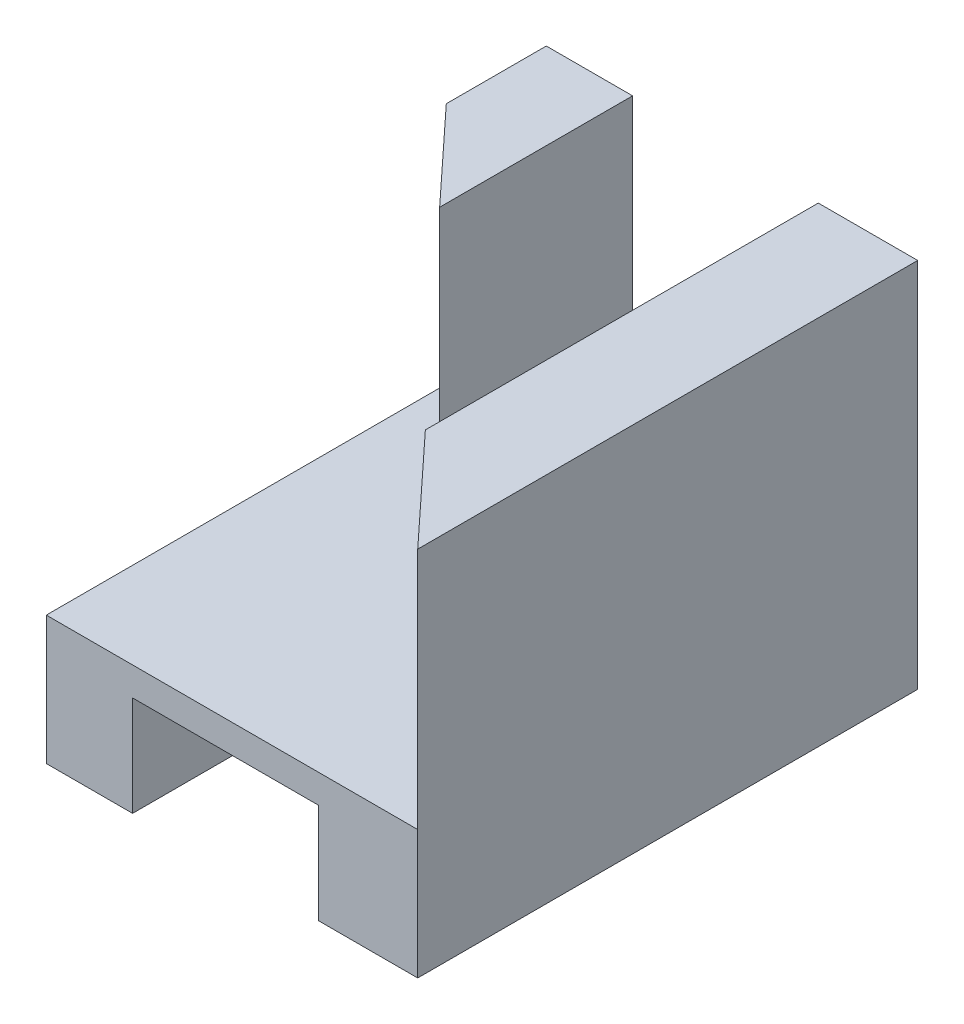
ISO-10303-21;
HEADER;
FILE_DESCRIPTION(('STEP AP214'),'2;1');
FILE_NAME('part.step','',(''),(''),'','','');
FILE_SCHEMA(('AUTOMOTIVE_DESIGN { 1 0 10303 214 1 1 1 1 }'));
ENDSEC;
DATA;
#1=APPLICATION_CONTEXT('core data for automotive mechanical design processes');
#2=APPLICATION_PROTOCOL_DEFINITION('international standard','automotive_design',2000,#1);
#3=PRODUCT_CONTEXT('',#1,'mechanical');
#4=PRODUCT('Part','Part','',(#3));
#5=PRODUCT_RELATED_PRODUCT_CATEGORY('part','',(#4));
#6=PRODUCT_DEFINITION_FORMATION('','',#4);
#7=PRODUCT_DEFINITION_CONTEXT('part definition',#1,'design');
#8=PRODUCT_DEFINITION('design','',#6,#7);
#9=PRODUCT_DEFINITION_SHAPE('','',#8);
#10=(LENGTH_UNIT() NAMED_UNIT(*) SI_UNIT(.MILLI.,.METRE.));
#11=(NAMED_UNIT(*) PLANE_ANGLE_UNIT() SI_UNIT($,.RADIAN.));
#12=(NAMED_UNIT(*) SI_UNIT($,.STERADIAN.) SOLID_ANGLE_UNIT());
#13=UNCERTAINTY_MEASURE_WITH_UNIT(LENGTH_MEASURE(1.E-05),#10,'distance_accuracy_value','');
#14=(GEOMETRIC_REPRESENTATION_CONTEXT(3) GLOBAL_UNCERTAINTY_ASSIGNED_CONTEXT((#13)) GLOBAL_UNIT_ASSIGNED_CONTEXT((#10,
#11,#12)) REPRESENTATION_CONTEXT('',''));
#15=CARTESIAN_POINT('',(0.,0.,0.));
#16=DIRECTION('',(0.,0.,1.));
#17=DIRECTION('',(1.,0.,0.));
#18=AXIS2_PLACEMENT_3D('',#15,#16,#17);
#19=CARTESIAN_POINT('',(6.0411257674123,13.,35.));
#20=DIRECTION('',(0.,-1.,0.));
#21=DIRECTION('',(1.,0.,0.));
#22=AXIS2_PLACEMENT_3D('',#19,#20,#21);
#23=PLANE('',#22);
#24=DIRECTION('',(0.680451099367278,0.,0.732793491626299));
#25=VECTOR('',#24,1.);
#26=CARTESIAN_POINT('',(-10.4712328767123,13.,9.72328767123288));
#27=LINE('',#26,#25);
#28=CARTESIAN_POINT('',(6.0411257674123,13.,27.5058277495209));
#29=VERTEX_POINT('',#28);
#30=CARTESIAN_POINT('',(13.,13.,35.));
#31=VERTEX_POINT('',#30);
#32=EDGE_CURVE('E202',#29,#31,#27,.T.);
#33=ORIENTED_EDGE('',*,*,#32,.T.);
#34=DIRECTION('',(0.,0.,-1.));
#35=VECTOR('',#34,1.);
#36=CARTESIAN_POINT('',(13.,13.,35.));
#37=LINE('',#36,#35);
#38=CARTESIAN_POINT('',(13.,13.,0.));
#39=VERTEX_POINT('',#38);
#40=EDGE_CURVE('E41',#31,#39,#37,.T.);
#41=ORIENTED_EDGE('',*,*,#40,.T.);
#42=DIRECTION('',(-1.,0.,0.));
#43=VECTOR('',#42,1.);
#44=CARTESIAN_POINT('',(6.0411257674123,13.,0.));
#45=LINE('',#44,#43);
#46=CARTESIAN_POINT('',(6.0411257674123,13.,0.));
#47=VERTEX_POINT('',#46);
#48=EDGE_CURVE('E154',#39,#47,#45,.T.);
#49=ORIENTED_EDGE('',*,*,#48,.T.);
#50=DIRECTION('',(0.,0.,-1.));
#51=VECTOR('',#50,1.);
#52=CARTESIAN_POINT('',(6.0411257674123,13.,35.));
#53=LINE('',#52,#51);
#54=EDGE_CURVE('E192',#29,#47,#53,.T.);
#55=ORIENTED_EDGE('',*,*,#54,.F.);
#56=EDGE_LOOP('',(#33,#41,#49,#55));
#57=FACE_BOUND('',#56,.T.);
#58=ADVANCED_FACE('F33',(#57),#23,.F.);
#59=CARTESIAN_POINT('',(6.0411257674123,0.,35.));
#60=DIRECTION('',(1.,0.,0.));
#61=DIRECTION('',(0.,0.,-1.));
#62=AXIS2_PLACEMENT_3D('',#59,#60,#61);
#63=PLANE('',#62);
#64=DIRECTION('',(0.,-1.,0.));
#65=VECTOR('',#64,1.);
#66=CARTESIAN_POINT('',(6.0411257674123,0.,27.5058277495209));
#67=LINE('',#66,#65);
#68=CARTESIAN_POINT('',(6.0411257674123,0.,27.5058277495209));
#69=VERTEX_POINT('',#68);
#70=EDGE_CURVE('E152',#29,#69,#67,.T.);
#71=ORIENTED_EDGE('',*,*,#70,.F.);
#72=ORIENTED_EDGE('',*,*,#54,.T.);
#73=DIRECTION('',(0.,-1.,0.));
#74=VECTOR('',#73,1.);
#75=CARTESIAN_POINT('',(6.0411257674123,0.,0.));
#76=LINE('',#75,#74);
#77=CARTESIAN_POINT('',(6.0411257674123,0.,0.));
#78=VERTEX_POINT('',#77);
#79=EDGE_CURVE('E157',#47,#78,#76,.T.);
#80=ORIENTED_EDGE('',*,*,#79,.T.);
#81=DIRECTION('',(0.,0.,-1.));
#82=VECTOR('',#81,1.);
#83=CARTESIAN_POINT('',(6.0411257674123,0.,35.));
#84=LINE('',#83,#82);
#85=EDGE_CURVE('E190',#69,#78,#84,.T.);
#86=ORIENTED_EDGE('',*,*,#85,.F.);
#87=EDGE_LOOP('',(#71,#72,#80,#86));
#88=FACE_BOUND('',#87,.T.);
#89=ADVANCED_FACE('F211',(#88),#63,.F.);
#90=CARTESIAN_POINT('',(-6.9588742325877,0.,35.));
#91=DIRECTION('',(0.,-1.,0.));
#92=DIRECTION('',(0.,0.,-1.));
#93=AXIS2_PLACEMENT_3D('',#90,#91,#92);
#94=PLANE('',#93);
#95=DIRECTION('',(-0.680451099367278,0.,-0.732793491626299));
#96=VECTOR('',#95,1.);
#97=CARTESIAN_POINT('',(3.75876782107583,0.,25.0479038073124));
#98=LINE('',#97,#96);
#99=CARTESIAN_POINT('',(-6.9588742325877,0.,13.5058277495209));
#100=VERTEX_POINT('',#99);
#101=EDGE_CURVE('E253',#69,#100,#98,.T.);
#102=ORIENTED_EDGE('',*,*,#101,.F.);
#103=ORIENTED_EDGE('',*,*,#85,.T.);
#104=DIRECTION('',(-1.,0.,0.));
#105=VECTOR('',#104,1.);
#106=CARTESIAN_POINT('',(-6.9588742325877,0.,0.));
#107=LINE('',#106,#105);
#108=CARTESIAN_POINT('',(-6.9588742325877,0.,0.));
#109=VERTEX_POINT('',#108);
#110=EDGE_CURVE('E160',#78,#109,#107,.T.);
#111=ORIENTED_EDGE('',*,*,#110,.T.);
#112=DIRECTION('',(0.,0.,-1.));
#113=VECTOR('',#112,1.);
#114=CARTESIAN_POINT('',(-6.9588742325877,0.,35.));
#115=LINE('',#114,#113);
#116=EDGE_CURVE('E188',#100,#109,#115,.T.);
#117=ORIENTED_EDGE('',*,*,#116,.F.);
#118=EDGE_LOOP('',(#102,#103,#111,#117));
#119=FACE_BOUND('',#118,.T.);
#120=ADVANCED_FACE('F289',(#119),#94,.F.);
#121=CARTESIAN_POINT('',(-6.9588742325877,13.,35.));
#122=DIRECTION('',(-1.,0.,0.));
#123=DIRECTION('',(0.,0.,1.));
#124=AXIS2_PLACEMENT_3D('',#121,#122,#123);
#125=PLANE('',#124);
#126=DIRECTION('',(0.,1.,0.));
#127=VECTOR('',#126,1.);
#128=CARTESIAN_POINT('',(-6.9588742325877,13.,13.5058277495209));
#129=LINE('',#128,#127);
#130=CARTESIAN_POINT('',(-6.9588742325877,13.,13.5058277495209));
#131=VERTEX_POINT('',#130);
#132=EDGE_CURVE('E255',#100,#131,#129,.T.);
#133=ORIENTED_EDGE('',*,*,#132,.F.);
#134=ORIENTED_EDGE('',*,*,#116,.T.);
#135=DIRECTION('',(0.,1.,0.));
#136=VECTOR('',#135,1.);
#137=CARTESIAN_POINT('',(-6.9588742325877,13.,0.));
#138=LINE('',#137,#136);
#139=CARTESIAN_POINT('',(-6.9588742325877,13.,0.));
#140=VERTEX_POINT('',#139);
#141=EDGE_CURVE('E163',#109,#140,#138,.T.);
#142=ORIENTED_EDGE('',*,*,#141,.T.);
#143=DIRECTION('',(0.,0.,-1.));
#144=VECTOR('',#143,1.);
#145=CARTESIAN_POINT('',(-6.9588742325877,13.,35.));
#146=LINE('',#145,#144);
#147=EDGE_CURVE('E186',#131,#140,#146,.T.);
#148=ORIENTED_EDGE('',*,*,#147,.F.);
#149=EDGE_LOOP('',(#133,#134,#142,#148));
#150=FACE_BOUND('',#149,.T.);
#151=ADVANCED_FACE('F266',(#150),#125,.F.);
#152=CARTESIAN_POINT('',(-13.,13.,35.));
#153=DIRECTION('',(0.,-1.,0.));
#154=DIRECTION('',(1.,0.,0.));
#155=AXIS2_PLACEMENT_3D('',#152,#153,#154);
#156=PLANE('',#155);
#157=CARTESIAN_POINT('',(-13.,13.,7.));
#158=VERTEX_POINT('',#157);
#159=EDGE_CURVE('E241',#158,#131,#27,.T.);
#160=ORIENTED_EDGE('',*,*,#159,.T.);
#161=ORIENTED_EDGE('',*,*,#147,.T.);
#162=DIRECTION('',(-1.,0.,0.));
#163=VECTOR('',#162,1.);
#164=CARTESIAN_POINT('',(-13.,13.,0.));
#165=LINE('',#164,#163);
#166=CARTESIAN_POINT('',(-13.,13.,0.));
#167=VERTEX_POINT('',#166);
#168=EDGE_CURVE('E166',#140,#167,#165,.T.);
#169=ORIENTED_EDGE('',*,*,#168,.T.);
#170=DIRECTION('',(0.,0.,-1.));
#171=VECTOR('',#170,1.);
#172=CARTESIAN_POINT('',(-13.,13.,35.));
#173=LINE('',#172,#171);
#174=EDGE_CURVE('E184',#158,#167,#173,.T.);
#175=ORIENTED_EDGE('',*,*,#174,.F.);
#176=EDGE_LOOP('',(#160,#161,#169,#175));
#177=FACE_BOUND('',#176,.T.);
#178=ADVANCED_FACE('F263',(#177),#156,.F.);
#179=CARTESIAN_POINT('',(-13.,13.,35.));
#180=DIRECTION('',(1.,0.,0.));
#181=DIRECTION('',(0.,1.,0.));
#182=AXIS2_PLACEMENT_3D('',#179,#180,#181);
#183=PLANE('',#182);
#184=DIRECTION('',(0.,1.,0.));
#185=VECTOR('',#184,1.);
#186=CARTESIAN_POINT('',(-13.,-4.,7.));
#187=LINE('',#186,#185);
#188=CARTESIAN_POINT('',(-13.,-4.,7.));
#189=VERTEX_POINT('',#188);
#190=EDGE_CURVE('E236',#189,#158,#187,.T.);
#191=ORIENTED_EDGE('',*,*,#190,.T.);
#192=ORIENTED_EDGE('',*,*,#174,.T.);
#193=DIRECTION('',(0.,-1.,0.));
#194=VECTOR('',#193,1.);
#195=CARTESIAN_POINT('',(-13.,13.,0.));
#196=LINE('',#195,#194);
#197=CARTESIAN_POINT('',(-13.,-13.,0.));
#198=VERTEX_POINT('',#197);
#199=EDGE_CURVE('E169',#167,#198,#196,.T.);
#200=ORIENTED_EDGE('',*,*,#199,.T.);
#201=DIRECTION('',(0.,0.,-1.));
#202=VECTOR('',#201,1.);
#203=CARTESIAN_POINT('',(-13.,-13.,35.));
#204=LINE('',#203,#202);
#205=CARTESIAN_POINT('',(-13.,-13.,35.));
#206=VERTEX_POINT('',#205);
#207=EDGE_CURVE('E181',#206,#198,#204,.T.);
#208=ORIENTED_EDGE('',*,*,#207,.F.);
#209=DIRECTION('',(0.,-1.,0.));
#210=VECTOR('',#209,1.);
#211=CARTESIAN_POINT('',(-13.,13.,35.));
#212=LINE('',#211,#210);
#213=CARTESIAN_POINT('',(-13.,-4.,35.));
#214=VERTEX_POINT('',#213);
#215=EDGE_CURVE('E247',#214,#206,#212,.T.);
#216=ORIENTED_EDGE('',*,*,#215,.F.);
#217=DIRECTION('',(0.,0.,1.));
#218=VECTOR('',#217,1.);
#219=CARTESIAN_POINT('',(-13.,-4.,0.));
#220=LINE('',#219,#218);
#221=EDGE_CURVE('E48',#189,#214,#220,.T.);
#222=ORIENTED_EDGE('',*,*,#221,.F.);
#223=EDGE_LOOP('',(#191,#192,#200,#208,#216,#222));
#224=FACE_BOUND('',#223,.T.);
#225=ADVANCED_FACE('F273',(#224),#183,.F.);
#226=CARTESIAN_POINT('',(0.,0.,35.));
#227=DIRECTION('',(0.,0.,-1.));
#228=DIRECTION('',(-1.,0.,0.));
#229=AXIS2_PLACEMENT_3D('',#226,#227,#228);
#230=PLANE('',#229);
#231=DIRECTION('',(-1.,0.,0.));
#232=VECTOR('',#231,1.);
#233=CARTESIAN_POINT('',(0.,-4.00000000000001,35.));
#234=LINE('',#233,#232);
#235=CARTESIAN_POINT('',(13.,-4.00000000000001,35.));
#236=VERTEX_POINT('',#235);
#237=EDGE_CURVE('E237',#236,#214,#234,.T.);
#238=ORIENTED_EDGE('',*,*,#237,.T.);
#239=ORIENTED_EDGE('',*,*,#215,.T.);
#240=DIRECTION('',(1.,0.,0.));
#241=VECTOR('',#240,1.);
#242=CARTESIAN_POINT('',(-13.,-13.,35.));
#243=LINE('',#242,#241);
#244=CARTESIAN_POINT('',(-6.9588742325877,-13.,35.));
#245=VERTEX_POINT('',#244);
#246=EDGE_CURVE('E127',#206,#245,#243,.T.);
#247=ORIENTED_EDGE('',*,*,#246,.T.);
#248=DIRECTION('',(0.,1.,0.));
#249=VECTOR('',#248,1.);
#250=CARTESIAN_POINT('',(-6.9588742325877,-13.,35.));
#251=LINE('',#250,#249);
#252=CARTESIAN_POINT('',(-6.9588742325877,-6.,35.));
#253=VERTEX_POINT('',#252);
#254=EDGE_CURVE('E120',#245,#253,#251,.T.);
#255=ORIENTED_EDGE('',*,*,#254,.T.);
#256=DIRECTION('',(1.,0.,0.));
#257=VECTOR('',#256,1.);
#258=CARTESIAN_POINT('',(-6.9588742325877,-6.,35.));
#259=LINE('',#258,#257);
#260=CARTESIAN_POINT('',(6.0411257674123,-6.,35.));
#261=VERTEX_POINT('',#260);
#262=EDGE_CURVE('E124',#253,#261,#259,.T.);
#263=ORIENTED_EDGE('',*,*,#262,.T.);
#264=DIRECTION('',(0.,-1.,0.));
#265=VECTOR('',#264,1.);
#266=CARTESIAN_POINT('',(6.0411257674123,-6.,35.));
#267=LINE('',#266,#265);
#268=CARTESIAN_POINT('',(6.0411257674123,-13.,35.));
#269=VERTEX_POINT('',#268);
#270=EDGE_CURVE('E57',#261,#269,#267,.T.);
#271=ORIENTED_EDGE('',*,*,#270,.T.);
#272=DIRECTION('',(1.,0.,0.));
#273=VECTOR('',#272,1.);
#274=CARTESIAN_POINT('',(6.0411257674123,-13.,35.));
#275=LINE('',#274,#273);
#276=CARTESIAN_POINT('',(13.,-13.,35.));
#277=VERTEX_POINT('',#276);
#278=EDGE_CURVE('E177',#269,#277,#275,.T.);
#279=ORIENTED_EDGE('',*,*,#278,.T.);
#280=DIRECTION('',(0.,1.,0.));
#281=VECTOR('',#280,1.);
#282=CARTESIAN_POINT('',(13.,13.,35.));
#283=LINE('',#282,#281);
#284=EDGE_CURVE('E110',#277,#236,#283,.T.);
#285=ORIENTED_EDGE('',*,*,#284,.T.);
#286=EDGE_LOOP('',(#238,#239,#247,#255,#263,#271,#279,#285));
#287=FACE_BOUND('',#286,.T.);
#288=ADVANCED_FACE('F122',(#287),#230,.F.);
#289=CARTESIAN_POINT('',(6.0411257674123,-13.,35.));
#290=DIRECTION('',(0.,1.,0.));
#291=DIRECTION('',(0.,0.,1.));
#292=AXIS2_PLACEMENT_3D('',#289,#290,#291);
#293=PLANE('',#292);
#294=DIRECTION('',(1.,0.,0.));
#295=VECTOR('',#294,1.);
#296=CARTESIAN_POINT('',(6.0411257674123,-13.,0.));
#297=LINE('',#296,#295);
#298=CARTESIAN_POINT('',(6.0411257674123,-13.,0.));
#299=VERTEX_POINT('',#298);
#300=CARTESIAN_POINT('',(13.,-13.,0.));
#301=VERTEX_POINT('',#300);
#302=EDGE_CURVE('E148',#299,#301,#297,.T.);
#303=ORIENTED_EDGE('',*,*,#302,.T.);
#304=DIRECTION('',(0.,0.,-1.));
#305=VECTOR('',#304,1.);
#306=CARTESIAN_POINT('',(13.,-13.,35.));
#307=LINE('',#306,#305);
#308=EDGE_CURVE('E11',#277,#301,#307,.T.);
#309=ORIENTED_EDGE('',*,*,#308,.F.);
#310=ORIENTED_EDGE('',*,*,#278,.F.);
#311=DIRECTION('',(0.,0.,-1.));
#312=VECTOR('',#311,1.);
#313=CARTESIAN_POINT('',(6.0411257674123,-13.,35.));
#314=LINE('',#313,#312);
#315=EDGE_CURVE('E144',#269,#299,#314,.T.);
#316=ORIENTED_EDGE('',*,*,#315,.T.);
#317=EDGE_LOOP('',(#303,#309,#310,#316));
#318=FACE_BOUND('',#317,.T.);
#319=ADVANCED_FACE('F35',(#318),#293,.F.);
#320=CARTESIAN_POINT('',(13.,13.,35.));
#321=DIRECTION('',(-1.,0.,0.));
#322=DIRECTION('',(0.,-1.,0.));
#323=AXIS2_PLACEMENT_3D('',#320,#321,#322);
#324=PLANE('',#323);
#325=DIRECTION('',(0.,1.,0.));
#326=VECTOR('',#325,1.);
#327=CARTESIAN_POINT('',(13.,13.,0.));
#328=LINE('',#327,#326);
#329=EDGE_CURVE('E151',#301,#39,#328,.T.);
#330=ORIENTED_EDGE('',*,*,#329,.T.);
#331=ORIENTED_EDGE('',*,*,#40,.F.);
#332=DIRECTION('',(0.,1.,0.));
#333=VECTOR('',#332,1.);
#334=CARTESIAN_POINT('',(13.,-4.00000000000001,35.));
#335=LINE('',#334,#333);
#336=EDGE_CURVE('E234',#236,#31,#335,.T.);
#337=ORIENTED_EDGE('',*,*,#336,.F.);
#338=ORIENTED_EDGE('',*,*,#284,.F.);
#339=ORIENTED_EDGE('',*,*,#308,.T.);
#340=EDGE_LOOP('',(#330,#331,#337,#338,#339));
#341=FACE_BOUND('',#340,.T.);
#342=ADVANCED_FACE('F243',(#341),#324,.F.);
#343=CARTESIAN_POINT('',(-13.,-13.,35.));
#344=DIRECTION('',(0.,1.,0.));
#345=DIRECTION('',(0.,0.,1.));
#346=AXIS2_PLACEMENT_3D('',#343,#344,#345);
#347=PLANE('',#346);
#348=DIRECTION('',(1.,0.,0.));
#349=VECTOR('',#348,1.);
#350=CARTESIAN_POINT('',(-13.,-13.,0.));
#351=LINE('',#350,#349);
#352=CARTESIAN_POINT('',(-6.9588742325877,-13.,0.));
#353=VERTEX_POINT('',#352);
#354=EDGE_CURVE('E171',#198,#353,#351,.T.);
#355=ORIENTED_EDGE('',*,*,#354,.T.);
#356=DIRECTION('',(0.,0.,-1.));
#357=VECTOR('',#356,1.);
#358=CARTESIAN_POINT('',(-6.9588742325877,-13.,35.));
#359=LINE('',#358,#357);
#360=EDGE_CURVE('E139',#245,#353,#359,.T.);
#361=ORIENTED_EDGE('',*,*,#360,.F.);
#362=ORIENTED_EDGE('',*,*,#246,.F.);
#363=ORIENTED_EDGE('',*,*,#207,.T.);
#364=EDGE_LOOP('',(#355,#361,#362,#363));
#365=FACE_BOUND('',#364,.T.);
#366=ADVANCED_FACE('F275',(#365),#347,.F.);
#367=CARTESIAN_POINT('',(-6.9588742325877,-13.,35.));
#368=DIRECTION('',(-1.,0.,0.));
#369=DIRECTION('',(0.,0.,1.));
#370=AXIS2_PLACEMENT_3D('',#367,#368,#369);
#371=PLANE('',#370);
#372=DIRECTION('',(0.,1.,0.));
#373=VECTOR('',#372,1.);
#374=CARTESIAN_POINT('',(-6.9588742325877,-13.,0.));
#375=LINE('',#374,#373);
#376=CARTESIAN_POINT('',(-6.9588742325877,-6.,0.));
#377=VERTEX_POINT('',#376);
#378=EDGE_CURVE('E136',#353,#377,#375,.T.);
#379=ORIENTED_EDGE('',*,*,#378,.T.);
#380=DIRECTION('',(0.,0.,-1.));
#381=VECTOR('',#380,1.);
#382=CARTESIAN_POINT('',(-6.9588742325877,-6.,35.));
#383=LINE('',#382,#381);
#384=EDGE_CURVE('E133',#253,#377,#383,.T.);
#385=ORIENTED_EDGE('',*,*,#384,.F.);
#386=ORIENTED_EDGE('',*,*,#254,.F.);
#387=ORIENTED_EDGE('',*,*,#360,.T.);
#388=EDGE_LOOP('',(#379,#385,#386,#387));
#389=FACE_BOUND('',#388,.T.);
#390=ADVANCED_FACE('F134',(#389),#371,.F.);
#391=CARTESIAN_POINT('',(-6.9588742325877,-6.,35.));
#392=DIRECTION('',(0.,1.,0.));
#393=DIRECTION('',(0.,0.,1.));
#394=AXIS2_PLACEMENT_3D('',#391,#392,#393);
#395=PLANE('',#394);
#396=DIRECTION('',(1.,0.,0.));
#397=VECTOR('',#396,1.);
#398=CARTESIAN_POINT('',(-6.9588742325877,-6.,0.));
#399=LINE('',#398,#397);
#400=CARTESIAN_POINT('',(6.0411257674123,-6.,0.));
#401=VERTEX_POINT('',#400);
#402=EDGE_CURVE('E174',#377,#401,#399,.T.);
#403=ORIENTED_EDGE('',*,*,#402,.T.);
#404=DIRECTION('',(0.,0.,-1.));
#405=VECTOR('',#404,1.);
#406=CARTESIAN_POINT('',(6.0411257674123,-6.,35.));
#407=LINE('',#406,#405);
#408=EDGE_CURVE('E140',#261,#401,#407,.T.);
#409=ORIENTED_EDGE('',*,*,#408,.F.);
#410=ORIENTED_EDGE('',*,*,#262,.F.);
#411=ORIENTED_EDGE('',*,*,#384,.T.);
#412=EDGE_LOOP('',(#403,#409,#410,#411));
#413=FACE_BOUND('',#412,.T.);
#414=ADVANCED_FACE('F142',(#413),#395,.F.);
#415=CARTESIAN_POINT('',(6.0411257674123,-6.,35.));
#416=DIRECTION('',(1.,0.,0.));
#417=DIRECTION('',(0.,1.,0.));
#418=AXIS2_PLACEMENT_3D('',#415,#416,#417);
#419=PLANE('',#418);
#420=DIRECTION('',(0.,-1.,0.));
#421=VECTOR('',#420,1.);
#422=CARTESIAN_POINT('',(6.0411257674123,-6.,0.));
#423=LINE('',#422,#421);
#424=EDGE_CURVE('E102',#401,#299,#423,.T.);
#425=ORIENTED_EDGE('',*,*,#424,.T.);
#426=ORIENTED_EDGE('',*,*,#315,.F.);
#427=ORIENTED_EDGE('',*,*,#270,.F.);
#428=ORIENTED_EDGE('',*,*,#408,.T.);
#429=EDGE_LOOP('',(#425,#426,#427,#428));
#430=FACE_BOUND('',#429,.T.);
#431=ADVANCED_FACE('F276',(#430),#419,.F.);
#432=CARTESIAN_POINT('',(0.,0.,0.));
#433=DIRECTION('',(0.,0.,-1.));
#434=DIRECTION('',(-1.,0.,0.));
#435=AXIS2_PLACEMENT_3D('',#432,#433,#434);
#436=PLANE('',#435);
#437=ORIENTED_EDGE('',*,*,#302,.F.);
#438=ORIENTED_EDGE('',*,*,#424,.F.);
#439=ORIENTED_EDGE('',*,*,#402,.F.);
#440=ORIENTED_EDGE('',*,*,#378,.F.);
#441=ORIENTED_EDGE('',*,*,#354,.F.);
#442=ORIENTED_EDGE('',*,*,#199,.F.);
#443=ORIENTED_EDGE('',*,*,#168,.F.);
#444=ORIENTED_EDGE('',*,*,#141,.F.);
#445=ORIENTED_EDGE('',*,*,#110,.F.);
#446=ORIENTED_EDGE('',*,*,#79,.F.);
#447=ORIENTED_EDGE('',*,*,#48,.F.);
#448=ORIENTED_EDGE('',*,*,#329,.F.);
#449=EDGE_LOOP('',(#437,#438,#439,#440,#441,#442,#443,#444,#445,#446,#447,#448));
#450=FACE_BOUND('',#449,.T.);
#451=ADVANCED_FACE('F205',(#450),#436,.T.);
#452=CARTESIAN_POINT('',(-10.4712328767123,-4.,9.72328767123288));
#453=DIRECTION('',(-0.732793491626299,0.,0.680451099367278));
#454=DIRECTION('',(0.680451099367278,0.,0.732793491626299));
#455=AXIS2_PLACEMENT_3D('',#452,#453,#454);
#456=PLANE('',#455);
#457=ORIENTED_EDGE('',*,*,#70,.T.);
#458=ORIENTED_EDGE('',*,*,#101,.T.);
#459=ORIENTED_EDGE('',*,*,#132,.T.);
#460=ORIENTED_EDGE('',*,*,#159,.F.);
#461=ORIENTED_EDGE('',*,*,#190,.F.);
#462=DIRECTION('',(0.680451099367278,0.,0.732793491626299));
#463=VECTOR('',#462,1.);
#464=CARTESIAN_POINT('',(-10.4712328767123,-4.,9.72328767123288));
#465=LINE('',#464,#463);
#466=EDGE_CURVE('E232',#189,#236,#465,.T.);
#467=ORIENTED_EDGE('',*,*,#466,.T.);
#468=ORIENTED_EDGE('',*,*,#336,.T.);
#469=ORIENTED_EDGE('',*,*,#32,.F.);
#470=EDGE_LOOP('',(#457,#458,#459,#460,#461,#467,#468,#469));
#471=FACE_BOUND('',#470,.T.);
#472=ADVANCED_FACE('F233',(#471),#456,.T.);
#473=CARTESIAN_POINT('',(0.,-4.00000000000001,0.));
#474=DIRECTION('',(0.,1.,0.));
#475=DIRECTION('',(-1.,0.,0.));
#476=AXIS2_PLACEMENT_3D('',#473,#474,#475);
#477=PLANE('',#476);
#478=ORIENTED_EDGE('',*,*,#237,.F.);
#479=ORIENTED_EDGE('',*,*,#466,.F.);
#480=ORIENTED_EDGE('',*,*,#221,.T.);
#481=EDGE_LOOP('',(#478,#479,#480));
#482=FACE_BOUND('',#481,.T.);
#483=ADVANCED_FACE('F239',(#482),#477,.T.);
#484=CLOSED_SHELL('',(#58,#89,#120,#151,#178,#225,#288,#319,#342,#366,#390,#414,#431,#451,#472,#483));
#485=MANIFOLD_SOLID_BREP('B2',#484);
#486=ADVANCED_BREP_SHAPE_REPRESENTATION('',(#18,#485),#14);
#487=SHAPE_DEFINITION_REPRESENTATION(#9,#486);
ENDSEC;
END-ISO-10303-21;
